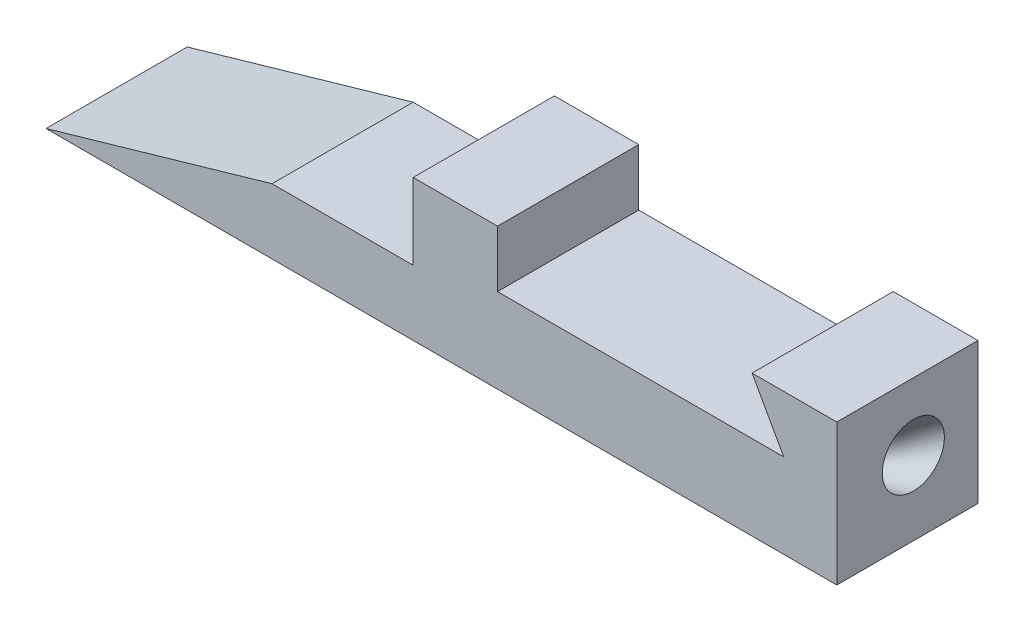
ISO-10303-21;
HEADER;
FILE_DESCRIPTION(('STEP AP214'),'2;1');
FILE_NAME('part.step','',(''),(''),'','','');
FILE_SCHEMA(('AUTOMOTIVE_DESIGN { 1 0 10303 214 1 1 1 1 }'));
ENDSEC;
DATA;
#1=APPLICATION_CONTEXT('core data for automotive mechanical design processes');
#2=APPLICATION_PROTOCOL_DEFINITION('international standard','automotive_design',2000,#1);
#3=PRODUCT_CONTEXT('',#1,'mechanical');
#4=PRODUCT('Part','Part','',(#3));
#5=PRODUCT_RELATED_PRODUCT_CATEGORY('part','',(#4));
#6=PRODUCT_DEFINITION_FORMATION('','',#4);
#7=PRODUCT_DEFINITION_CONTEXT('part definition',#1,'design');
#8=PRODUCT_DEFINITION('design','',#6,#7);
#9=PRODUCT_DEFINITION_SHAPE('','',#8);
#10=(LENGTH_UNIT() NAMED_UNIT(*) SI_UNIT(.MILLI.,.METRE.));
#11=(NAMED_UNIT(*) PLANE_ANGLE_UNIT() SI_UNIT($,.RADIAN.));
#12=(NAMED_UNIT(*) SI_UNIT($,.STERADIAN.) SOLID_ANGLE_UNIT());
#13=UNCERTAINTY_MEASURE_WITH_UNIT(LENGTH_MEASURE(1.E-05),#10,'distance_accuracy_value','');
#14=(GEOMETRIC_REPRESENTATION_CONTEXT(3) GLOBAL_UNCERTAINTY_ASSIGNED_CONTEXT((#13)) GLOBAL_UNIT_ASSIGNED_CONTEXT((#10,
#11,#12)) REPRESENTATION_CONTEXT('',''));
#15=CARTESIAN_POINT('',(0.,0.,0.));
#16=DIRECTION('',(0.,0.,1.));
#17=DIRECTION('',(1.,0.,0.));
#18=AXIS2_PLACEMENT_3D('',#15,#16,#17);
#19=CARTESIAN_POINT('',(0.,5.,0.));
#20=DIRECTION('',(0.,0.,-1.));
#21=DIRECTION('',(-1.,0.,0.));
#22=AXIS2_PLACEMENT_3D('',#19,#20,#21);
#23=PLANE('',#22);
#24=DIRECTION('',(0.487128200879869,-0.873330473479279,0.));
#25=VECTOR('',#24,1.);
#26=CARTESIAN_POINT('',(12.,5.,0.));
#27=LINE('',#26,#25);
#28=CARTESIAN_POINT('',(12.,5.,0.));
#29=VERTEX_POINT('',#28);
#30=CARTESIAN_POINT('',(13.1203948620237,2.99133991099766,0.));
#31=VERTEX_POINT('',#30);
#32=EDGE_CURVE('E193',#29,#31,#27,.T.);
#33=ORIENTED_EDGE('',*,*,#32,.T.);
#34=DIRECTION('',(1.,0.,0.));
#35=VECTOR('',#34,1.);
#36=CARTESIAN_POINT('',(2.98623493666464,2.99133991099766,0.));
#37=LINE('',#36,#35);
#38=CARTESIAN_POINT('',(2.98623493666464,2.99133991099766,0.));
#39=VERTEX_POINT('',#38);
#40=EDGE_CURVE('E188',#39,#31,#37,.T.);
#41=ORIENTED_EDGE('',*,*,#40,.F.);
#42=DIRECTION('',(0.,-1.,0.));
#43=VECTOR('',#42,1.);
#44=CARTESIAN_POINT('',(2.98623493666464,5.,0.));
#45=LINE('',#44,#43);
#46=CARTESIAN_POINT('',(2.98623493666464,5.,0.));
#47=VERTEX_POINT('',#46);
#48=EDGE_CURVE('E184',#47,#39,#45,.T.);
#49=ORIENTED_EDGE('',*,*,#48,.F.);
#50=DIRECTION('',(1.,0.,0.));
#51=VECTOR('',#50,1.);
#52=CARTESIAN_POINT('',(0.,5.,0.));
#53=LINE('',#52,#51);
#54=CARTESIAN_POINT('',(0.,5.,0.));
#55=VERTEX_POINT('',#54);
#56=EDGE_CURVE('E230',#55,#47,#53,.T.);
#57=ORIENTED_EDGE('',*,*,#56,.F.);
#58=DIRECTION('',(0.,-1.,0.));
#59=VECTOR('',#58,1.);
#60=CARTESIAN_POINT('',(0.,5.,0.));
#61=LINE('',#60,#59);
#62=CARTESIAN_POINT('',(0.,2.30658029150277,0.));
#63=VERTEX_POINT('',#62);
#64=EDGE_CURVE('E12',#55,#63,#61,.T.);
#65=ORIENTED_EDGE('',*,*,#64,.T.);
#66=DIRECTION('',(1.,0.,0.));
#67=VECTOR('',#66,1.);
#68=CARTESIAN_POINT('',(-5.,2.30658029150277,0.));
#69=LINE('',#68,#67);
#70=CARTESIAN_POINT('',(-5.,2.30658029150277,0.));
#71=VERTEX_POINT('',#70);
#72=EDGE_CURVE('E179',#71,#63,#69,.T.);
#73=ORIENTED_EDGE('',*,*,#72,.F.);
#74=DIRECTION('',(-0.960876363236828,-0.276977642730901,0.));
#75=VECTOR('',#74,1.);
#76=CARTESIAN_POINT('',(-13.0018678047824,0.,0.));
#77=LINE('',#76,#75);
#78=CARTESIAN_POINT('',(-13.0018678047824,0.,0.));
#79=VERTEX_POINT('',#78);
#80=EDGE_CURVE('E165',#71,#79,#77,.T.);
#81=ORIENTED_EDGE('',*,*,#80,.T.);
#82=DIRECTION('',(1.,0.,0.));
#83=VECTOR('',#82,1.);
#84=CARTESIAN_POINT('',(0.,0.,0.));
#85=LINE('',#84,#83);
#86=CARTESIAN_POINT('',(15.,0.,0.));
#87=VERTEX_POINT('',#86);
#88=EDGE_CURVE('E156',#79,#87,#85,.T.);
#89=ORIENTED_EDGE('',*,*,#88,.T.);
#90=DIRECTION('',(0.,-1.,0.));
#91=VECTOR('',#90,1.);
#92=CARTESIAN_POINT('',(15.,5.,0.));
#93=LINE('',#92,#91);
#94=CARTESIAN_POINT('',(15.,5.,0.));
#95=VERTEX_POINT('',#94);
#96=EDGE_CURVE('E67',#95,#87,#93,.T.);
#97=ORIENTED_EDGE('',*,*,#96,.F.);
#98=EDGE_CURVE('E229',#29,#95,#53,.T.);
#99=ORIENTED_EDGE('',*,*,#98,.F.);
#100=EDGE_LOOP('',(#33,#41,#49,#57,#65,#73,#81,#89,#97,#99));
#101=FACE_BOUND('',#100,.T.);
#102=ADVANCED_FACE('F55',(#101),#23,.F.);
#103=CARTESIAN_POINT('',(0.,5.,-5.));
#104=DIRECTION('',(0.,0.,-1.));
#105=DIRECTION('',(-1.,0.,0.));
#106=AXIS2_PLACEMENT_3D('',#103,#104,#105);
#107=PLANE('',#106);
#108=DIRECTION('',(1.,0.,0.));
#109=VECTOR('',#108,1.);
#110=CARTESIAN_POINT('',(2.98623493666464,2.99133991099766,-5.));
#111=LINE('',#110,#109);
#112=CARTESIAN_POINT('',(2.98623493666464,2.99133991099766,-5.));
#113=VERTEX_POINT('',#112);
#114=CARTESIAN_POINT('',(13.1203948620237,2.99133991099766,-5.));
#115=VERTEX_POINT('',#114);
#116=EDGE_CURVE('E197',#113,#115,#111,.T.);
#117=ORIENTED_EDGE('',*,*,#116,.T.);
#118=DIRECTION('',(0.487128200879869,-0.873330473479279,0.));
#119=VECTOR('',#118,1.);
#120=CARTESIAN_POINT('',(12.,5.,-5.));
#121=LINE('',#120,#119);
#122=CARTESIAN_POINT('',(12.,5.,-5.));
#123=VERTEX_POINT('',#122);
#124=EDGE_CURVE('E151',#123,#115,#121,.T.);
#125=ORIENTED_EDGE('',*,*,#124,.F.);
#126=DIRECTION('',(1.,0.,0.));
#127=VECTOR('',#126,1.);
#128=CARTESIAN_POINT('',(0.,5.,-5.));
#129=LINE('',#128,#127);
#130=CARTESIAN_POINT('',(15.,5.,-5.));
#131=VERTEX_POINT('',#130);
#132=EDGE_CURVE('E220',#123,#131,#129,.T.);
#133=ORIENTED_EDGE('',*,*,#132,.T.);
#134=DIRECTION('',(0.,-1.,0.));
#135=VECTOR('',#134,1.);
#136=CARTESIAN_POINT('',(15.,5.,-5.));
#137=LINE('',#136,#135);
#138=CARTESIAN_POINT('',(15.,0.,-5.));
#139=VERTEX_POINT('',#138);
#140=EDGE_CURVE('E145',#131,#139,#137,.T.);
#141=ORIENTED_EDGE('',*,*,#140,.T.);
#142=DIRECTION('',(1.,0.,0.));
#143=VECTOR('',#142,1.);
#144=CARTESIAN_POINT('',(0.,0.,-5.));
#145=LINE('',#144,#143);
#146=CARTESIAN_POINT('',(-13.0018678047824,0.,-5.));
#147=VERTEX_POINT('',#146);
#148=EDGE_CURVE('E136',#147,#139,#145,.T.);
#149=ORIENTED_EDGE('',*,*,#148,.F.);
#150=DIRECTION('',(-0.960876363236828,-0.276977642730901,0.));
#151=VECTOR('',#150,1.);
#152=CARTESIAN_POINT('',(-13.0018678047824,0.,-5.));
#153=LINE('',#152,#151);
#154=CARTESIAN_POINT('',(-5.,2.30658029150277,-5.));
#155=VERTEX_POINT('',#154);
#156=EDGE_CURVE('E142',#155,#147,#153,.T.);
#157=ORIENTED_EDGE('',*,*,#156,.F.);
#158=DIRECTION('',(1.,0.,0.));
#159=VECTOR('',#158,1.);
#160=CARTESIAN_POINT('',(-5.,2.30658029150277,-5.));
#161=LINE('',#160,#159);
#162=CARTESIAN_POINT('',(0.,2.30658029150277,-5.));
#163=VERTEX_POINT('',#162);
#164=EDGE_CURVE('E174',#155,#163,#161,.T.);
#165=ORIENTED_EDGE('',*,*,#164,.T.);
#166=DIRECTION('',(0.,-1.,0.));
#167=VECTOR('',#166,1.);
#168=CARTESIAN_POINT('',(0.,5.,-5.));
#169=LINE('',#168,#167);
#170=CARTESIAN_POINT('',(0.,5.,-5.));
#171=VERTEX_POINT('',#170);
#172=EDGE_CURVE('E233',#171,#163,#169,.T.);
#173=ORIENTED_EDGE('',*,*,#172,.F.);
#174=CARTESIAN_POINT('',(2.98623493666464,5.,-5.));
#175=VERTEX_POINT('',#174);
#176=EDGE_CURVE('E221',#171,#175,#129,.T.);
#177=ORIENTED_EDGE('',*,*,#176,.T.);
#178=DIRECTION('',(0.,-1.,0.));
#179=VECTOR('',#178,1.);
#180=CARTESIAN_POINT('',(2.98623493666464,5.,-5.));
#181=LINE('',#180,#179);
#182=EDGE_CURVE('E82',#175,#113,#181,.T.);
#183=ORIENTED_EDGE('',*,*,#182,.T.);
#184=EDGE_LOOP('',(#117,#125,#133,#141,#149,#157,#165,#173,#177,#183));
#185=FACE_BOUND('',#184,.T.);
#186=ADVANCED_FACE('F139',(#185),#107,.T.);
#187=CARTESIAN_POINT('',(0.,5.,0.));
#188=DIRECTION('',(0.,-1.,0.));
#189=DIRECTION('',(0.,0.,-1.));
#190=AXIS2_PLACEMENT_3D('',#187,#188,#189);
#191=PLANE('',#190);
#192=DIRECTION('',(0.,0.,1.));
#193=VECTOR('',#192,1.);
#194=CARTESIAN_POINT('',(12.,5.,-15.3313074073858));
#195=LINE('',#194,#193);
#196=EDGE_CURVE('E183',#123,#29,#195,.T.);
#197=ORIENTED_EDGE('',*,*,#196,.T.);
#198=ORIENTED_EDGE('',*,*,#98,.T.);
#199=DIRECTION('',(0.,0.,-1.));
#200=VECTOR('',#199,1.);
#201=CARTESIAN_POINT('',(15.,5.,0.));
#202=LINE('',#201,#200);
#203=EDGE_CURVE('E225',#95,#131,#202,.T.);
#204=ORIENTED_EDGE('',*,*,#203,.T.);
#205=ORIENTED_EDGE('',*,*,#132,.F.);
#206=EDGE_LOOP('',(#197,#198,#204,#205));
#207=FACE_BOUND('',#206,.T.);
#208=ADVANCED_FACE('F274',(#207),#191,.F.);
#209=CARTESIAN_POINT('',(0.,5.,0.));
#210=DIRECTION('',(-1.,0.,0.));
#211=DIRECTION('',(0.,0.,1.));
#212=AXIS2_PLACEMENT_3D('',#209,#210,#211);
#213=PLANE('',#212);
#214=DIRECTION('',(0.,0.,-1.));
#215=VECTOR('',#214,1.);
#216=CARTESIAN_POINT('',(0.,2.30658029150277,0.));
#217=LINE('',#216,#215);
#218=EDGE_CURVE('E75',#63,#163,#217,.T.);
#219=ORIENTED_EDGE('',*,*,#218,.F.);
#220=ORIENTED_EDGE('',*,*,#64,.F.);
#221=DIRECTION('',(0.,0.,-1.));
#222=VECTOR('',#221,1.);
#223=CARTESIAN_POINT('',(0.,5.,0.));
#224=LINE('',#223,#222);
#225=EDGE_CURVE('E216',#55,#171,#224,.T.);
#226=ORIENTED_EDGE('',*,*,#225,.T.);
#227=ORIENTED_EDGE('',*,*,#172,.T.);
#228=EDGE_LOOP('',(#219,#220,#226,#227));
#229=FACE_BOUND('',#228,.T.);
#230=ADVANCED_FACE('F57',(#229),#213,.T.);
#231=CARTESIAN_POINT('',(15.,5.,0.));
#232=DIRECTION('',(-1.,0.,0.));
#233=DIRECTION('',(0.,0.,1.));
#234=AXIS2_PLACEMENT_3D('',#231,#232,#233);
#235=PLANE('',#234);
#236=CARTESIAN_POINT('',(15.,2.62562663396286,-2.7093762675392));
#237=DIRECTION('',(1.,0.,0.));
#238=DIRECTION('',(0.,0.,-1.));
#239=AXIS2_PLACEMENT_3D('',#236,#237,#238);
#240=CIRCLE('',#239,1.09960657927983);
#241=CARTESIAN_POINT('',(15.,1.57162976837628,-3.02278532377267));
#242=VERTEX_POINT('',#241);
#243=EDGE_CURVE('E168',#242,#242,#240,.T.);
#244=ORIENTED_EDGE('',*,*,#243,.F.);
#245=EDGE_LOOP('',(#244));
#246=FACE_BOUND('',#245,.T.);
#247=DIRECTION('',(0.,0.,-1.));
#248=VECTOR('',#247,1.);
#249=CARTESIAN_POINT('',(15.,0.,0.));
#250=LINE('',#249,#248);
#251=EDGE_CURVE('E150',#87,#139,#250,.T.);
#252=ORIENTED_EDGE('',*,*,#251,.T.);
#253=ORIENTED_EDGE('',*,*,#140,.F.);
#254=ORIENTED_EDGE('',*,*,#203,.F.);
#255=ORIENTED_EDGE('',*,*,#96,.T.);
#256=EDGE_LOOP('',(#252,#253,#254,#255));
#257=FACE_BOUND('',#256,.T.);
#258=ADVANCED_FACE('F269',(#246,#257),#235,.F.);
#259=ORIENTED_EDGE('',*,*,#56,.T.);
#260=DIRECTION('',(0.,0.,1.));
#261=VECTOR('',#260,1.);
#262=CARTESIAN_POINT('',(2.98623493666464,5.,-15.3313074073858));
#263=LINE('',#262,#261);
#264=EDGE_CURVE('E189',#175,#47,#263,.T.);
#265=ORIENTED_EDGE('',*,*,#264,.F.);
#266=ORIENTED_EDGE('',*,*,#176,.F.);
#267=ORIENTED_EDGE('',*,*,#225,.F.);
#268=EDGE_LOOP('',(#259,#265,#266,#267));
#269=FACE_BOUND('',#268,.T.);
#270=ADVANCED_FACE('F265',(#269),#191,.F.);
#271=CARTESIAN_POINT('',(0.,0.,0.));
#272=DIRECTION('',(0.,-1.,0.));
#273=DIRECTION('',(0.,0.,-1.));
#274=AXIS2_PLACEMENT_3D('',#271,#272,#273);
#275=PLANE('',#274);
#276=CARTESIAN_POINT('',(10.7758575453581,0.,-2.63389046128069));
#277=DIRECTION('',(0.,-1.,0.));
#278=DIRECTION('',(0.,0.,-1.));
#279=AXIS2_PLACEMENT_3D('',#276,#277,#278);
#280=CIRCLE('',#279,1.09960657927984);
#281=CARTESIAN_POINT('',(10.7758575453581,0.,-3.73349704056053));
#282=VERTEX_POINT('',#281);
#283=EDGE_CURVE('E250',#282,#282,#280,.T.);
#284=ORIENTED_EDGE('',*,*,#283,.F.);
#285=EDGE_LOOP('',(#284));
#286=FACE_BOUND('',#285,.T.);
#287=ORIENTED_EDGE('',*,*,#88,.F.);
#288=DIRECTION('',(0.,0.,1.));
#289=VECTOR('',#288,1.);
#290=CARTESIAN_POINT('',(-13.0018678047824,0.,-13.3276768072712));
#291=LINE('',#290,#289);
#292=EDGE_CURVE('E154',#147,#79,#291,.T.);
#293=ORIENTED_EDGE('',*,*,#292,.F.);
#294=ORIENTED_EDGE('',*,*,#148,.T.);
#295=ORIENTED_EDGE('',*,*,#251,.F.);
#296=EDGE_LOOP('',(#287,#293,#294,#295));
#297=FACE_BOUND('',#296,.T.);
#298=ADVANCED_FACE('F155',(#286,#297),#275,.T.);
#299=CARTESIAN_POINT('',(12.,5.,-15.3313074073858));
#300=DIRECTION('',(-0.873330473479279,-0.487128200879869,0.));
#301=DIRECTION('',(0.487128200879869,-0.873330473479279,0.));
#302=AXIS2_PLACEMENT_3D('',#299,#300,#301);
#303=PLANE('',#302);
#304=ORIENTED_EDGE('',*,*,#124,.T.);
#305=DIRECTION('',(0.,0.,1.));
#306=VECTOR('',#305,1.);
#307=CARTESIAN_POINT('',(13.1203948620237,2.99133991099766,-15.3313074073858));
#308=LINE('',#307,#306);
#309=EDGE_CURVE('E201',#115,#31,#308,.T.);
#310=ORIENTED_EDGE('',*,*,#309,.T.);
#311=ORIENTED_EDGE('',*,*,#32,.F.);
#312=ORIENTED_EDGE('',*,*,#196,.F.);
#313=EDGE_LOOP('',(#304,#310,#311,#312));
#314=FACE_BOUND('',#313,.T.);
#315=ADVANCED_FACE('F264',(#314),#303,.T.);
#316=CARTESIAN_POINT('',(2.98623493666464,2.99133991099766,-15.3313074073858));
#317=DIRECTION('',(0.,-1.,0.));
#318=DIRECTION('',(0.,0.,-1.));
#319=AXIS2_PLACEMENT_3D('',#316,#317,#318);
#320=PLANE('',#319);
#321=DIRECTION('',(0.,0.,1.));
#322=VECTOR('',#321,1.);
#323=CARTESIAN_POINT('',(2.98623493666464,2.99133991099766,-15.3313074073858));
#324=LINE('',#323,#322);
#325=EDGE_CURVE('E200',#113,#39,#324,.T.);
#326=ORIENTED_EDGE('',*,*,#325,.T.);
#327=ORIENTED_EDGE('',*,*,#40,.T.);
#328=ORIENTED_EDGE('',*,*,#309,.F.);
#329=ORIENTED_EDGE('',*,*,#116,.F.);
#330=EDGE_LOOP('',(#326,#327,#328,#329));
#331=FACE_BOUND('',#330,.T.);
#332=ADVANCED_FACE('F295',(#331),#320,.F.);
#333=CARTESIAN_POINT('',(2.98623493666464,5.,-15.3313074073858));
#334=DIRECTION('',(-1.,0.,0.));
#335=DIRECTION('',(0.,0.,1.));
#336=AXIS2_PLACEMENT_3D('',#333,#334,#335);
#337=PLANE('',#336);
#338=ORIENTED_EDGE('',*,*,#264,.T.);
#339=ORIENTED_EDGE('',*,*,#48,.T.);
#340=ORIENTED_EDGE('',*,*,#325,.F.);
#341=ORIENTED_EDGE('',*,*,#182,.F.);
#342=EDGE_LOOP('',(#338,#339,#340,#341));
#343=FACE_BOUND('',#342,.T.);
#344=ADVANCED_FACE('F292',(#343),#337,.F.);
#345=CARTESIAN_POINT('',(-5.,2.30658029150277,0.));
#346=DIRECTION('',(0.,-1.,0.));
#347=DIRECTION('',(0.,0.,-1.));
#348=AXIS2_PLACEMENT_3D('',#345,#346,#347);
#349=PLANE('',#348);
#350=ORIENTED_EDGE('',*,*,#218,.T.);
#351=ORIENTED_EDGE('',*,*,#164,.F.);
#352=DIRECTION('',(0.,0.,-1.));
#353=VECTOR('',#352,1.);
#354=CARTESIAN_POINT('',(-5.,2.30658029150277,0.));
#355=LINE('',#354,#353);
#356=EDGE_CURVE('E163',#71,#155,#355,.T.);
#357=ORIENTED_EDGE('',*,*,#356,.F.);
#358=ORIENTED_EDGE('',*,*,#72,.T.);
#359=EDGE_LOOP('',(#350,#351,#357,#358));
#360=FACE_BOUND('',#359,.T.);
#361=ADVANCED_FACE('F298',(#360),#349,.F.);
#362=CARTESIAN_POINT('',(-13.0018678047824,0.,-13.3276768072712));
#363=DIRECTION('',(-0.276977642730901,0.960876363236828,0.));
#364=DIRECTION('',(-0.960876363236828,-0.276977642730901,0.));
#365=AXIS2_PLACEMENT_3D('',#362,#363,#364);
#366=PLANE('',#365);
#367=ORIENTED_EDGE('',*,*,#356,.T.);
#368=ORIENTED_EDGE('',*,*,#156,.T.);
#369=ORIENTED_EDGE('',*,*,#292,.T.);
#370=ORIENTED_EDGE('',*,*,#80,.F.);
#371=EDGE_LOOP('',(#367,#368,#369,#370));
#372=FACE_BOUND('',#371,.T.);
#373=ADVANCED_FACE('F162',(#372),#366,.T.);
#374=CARTESIAN_POINT('',(10.7758575453581,0.,-3.73349704056053));
#375=CARTESIAN_POINT('',(15.,1.57162976837628,-3.02278532377267));
#376=CARTESIAN_POINT('',(10.6842236637514,0.,-3.73349704056052));
#377=CARTESIAN_POINT('',(15.,1.59774718972907,-3.11061839590489));
#378=CARTESIAN_POINT('',(10.580567416878,0.,-3.72235436055716));
#379=CARTESIAN_POINT('',(15.,1.63797171833462,-3.20679928866435));
#380=CARTESIAN_POINT('',(10.3553679894415,0.,-3.65667119422151));
#381=CARTESIAN_POINT('',(15.,1.76511663915561,-3.4039368791108));
#382=CARTESIAN_POINT('',(10.2333849662467,0.,-3.60154425104695));
#383=CARTESIAN_POINT('',(15.,1.85272452665518,-3.50514802404737));
#384=CARTESIAN_POINT('',(9.99880222933366,0.,-3.42560719836217));
#385=CARTESIAN_POINT('',(15.,2.08822462381217,-3.67985523970848));
#386=CARTESIAN_POINT('',(9.88678694319526,0.,-3.30354706319505));
#387=CARTESIAN_POINT('',(15.,2.23714843718079,-3.75243484247284));
#388=CARTESIAN_POINT('',(9.72444594879178,0.,-2.99915769868852));
#389=CARTESIAN_POINT('',(15.,2.57518258589898,-3.82128539068397));
#390=CARTESIAN_POINT('',(9.67625096607825,0.,-2.817158224494));
#391=CARTESIAN_POINT('',(15.,2.7633695459319,-3.81560797583136));
#392=CARTESIAN_POINT('',(9.67625096607825,0.,-2.45062269806738));
#393=CARTESIAN_POINT('',(15.,3.11470183446077,-3.7111382904202));
#394=CARTESIAN_POINT('',(9.72444594879178,0.,-2.26862322387285));
#395=CARTESIAN_POINT('',(15.,3.27541579763816,-3.61306899346312));
#396=CARTESIAN_POINT('',(9.88678694319526,0.,-1.96423385936633));
#397=CARTESIAN_POINT('',(15.,3.5209093253693,-3.37070478090128));
#398=CARTESIAN_POINT('',(9.99880222933367,0.,-1.84217372419921));
#399=CARTESIAN_POINT('',(15.,3.60598011025685,-3.22854619873228));
#400=CARTESIAN_POINT('',(10.2333849662467,0.,-1.66623667151443));
#401=CARTESIAN_POINT('',(15.,3.70775901008757,-2.95354808507646));
#402=CARTESIAN_POINT('',(10.3553679894415,0.,-1.61110972833987));
#403=CARTESIAN_POINT('',(15.,3.72583187497748,-2.82091245876821));
#404=CARTESIAN_POINT('',(10.580567416878,0.,-1.54542656200422));
#405=CARTESIAN_POINT('',(15.,3.72460444636523,-2.5863329330704));
#406=CARTESIAN_POINT('',(10.6842236637514,0.,-1.53428388200085));
#407=CARTESIAN_POINT('',(15.,3.70574092090223,-2.48380028343794));
#408=CARTESIAN_POINT('',(10.8674914269647,0.,-1.53428388200085));
#409=CARTESIAN_POINT('',(15.,3.65350607819666,-2.30813413917351));
#410=CARTESIAN_POINT('',(10.9711476738382,0.,-1.54542656200422));
#411=CARTESIAN_POINT('',(15.,3.6132815495911,-2.21195324641405));
#412=CARTESIAN_POINT('',(11.1963471012747,0.,-1.61110972833987));
#413=CARTESIAN_POINT('',(15.,3.48613662877012,-2.01481565596759));
#414=CARTESIAN_POINT('',(11.3183301244695,0.,-1.66623667151443));
#415=CARTESIAN_POINT('',(15.,3.39852874127054,-1.91360451103103));
#416=CARTESIAN_POINT('',(11.5529128613825,0.,-1.84217372419921));
#417=CARTESIAN_POINT('',(15.,3.16302864411355,-1.73889729536991));
#418=CARTESIAN_POINT('',(11.6649281475209,0.,-1.96423385936633));
#419=CARTESIAN_POINT('',(15.,3.01410483074493,-1.66631769260556));
#420=CARTESIAN_POINT('',(11.8272691419244,0.,-2.26862322387285));
#421=CARTESIAN_POINT('',(15.,2.67607068202674,-1.59746714439443));
#422=CARTESIAN_POINT('',(11.8754641246379,0.,-2.45062269806738));
#423=CARTESIAN_POINT('',(15.,2.48788372199382,-1.60314455924704));
#424=CARTESIAN_POINT('',(11.8754641246379,0.,-2.817158224494));
#425=CARTESIAN_POINT('',(15.,2.13655143346496,-1.70761424465819));
#426=CARTESIAN_POINT('',(11.8272691419244,0.,-2.99915769868852));
#427=CARTESIAN_POINT('',(15.,1.97583747028756,-1.80568354161528));
#428=CARTESIAN_POINT('',(11.6649281475209,0.,-3.30354706319505));
#429=CARTESIAN_POINT('',(15.,1.73034394255643,-2.04804775417712));
#430=CARTESIAN_POINT('',(11.5529128613825,0.,-3.42560719836217));
#431=CARTESIAN_POINT('',(15.,1.64527315766887,-2.19020633634611));
#432=CARTESIAN_POINT('',(11.3183301244695,0.,-3.60154425104695));
#433=CARTESIAN_POINT('',(15.,1.54349425783816,-2.46520445000194));
#434=CARTESIAN_POINT('',(11.1963471012747,0.,-3.65667119422151));
#435=CARTESIAN_POINT('',(15.,1.52542139294825,-2.59784007631018));
#436=CARTESIAN_POINT('',(10.9711476738382,0.,-3.72235436055716));
#437=CARTESIAN_POINT('',(15.,1.52664882156049,-2.832419602008));
#438=CARTESIAN_POINT('',(10.8674914269647,0.,-3.73349704056053));
#439=CARTESIAN_POINT('',(15.,1.54551234702349,-2.93495225164046));
#440=CARTESIAN_POINT('',(10.7758575453581,0.,-3.73349704056053));
#441=CARTESIAN_POINT('',(15.,1.57162976837628,-3.02278532377267));
#442=B_SPLINE_SURFACE_WITH_KNOTS('',3,1,((#374,#375),(#376,#377),(#378,#379),(#380,#381),(#382,
#383),(#384,#385),(#386,#387),(#388,#389),(#390,#391),(#392,#393),(#394,#395),(#396,#397),(#398,
#399),(#400,#401),(#402,#403),(#404,#405),(#406,#407),(#408,#409),(#410,#411),(#412,#413),(#414,
#415),(#416,#417),(#418,#419),(#420,#421),(#422,#423),(#424,#425),(#426,#427),(#428,#429),(#430,
#431),(#432,#433),(#434,#435),(#436,#437),(#438,#439),(#440,#441)),.UNSPECIFIED.,.T.,.F.,.F.,(4,
2,2,2,2,2,2,2,2,2,2,2,2,2,2,2,4),(2,2),(0.,0.0625,0.125,0.1875,0.25,0.3125,0.375,0.4375,0.5,
0.5625,0.625,0.6875,0.75,0.8125,0.875,0.9375,1.),(0.,1.),.UNSPECIFIED.);
#443=CARTESIAN_POINT('',(10.7758575453581,0.,-3.73349704056053));
#444=CARTESIAN_POINT('',(10.8198590292606,0.0163711434205856,-3.72609379351065));
#445=CARTESIAN_POINT('',(10.8638605131631,0.032742286841172,-3.71869054646078));
#446=CARTESIAN_POINT('',(10.9518634809682,0.0654845736823449,-3.70388405236103));
#447=CARTESIAN_POINT('',(10.9958649648707,0.0818557171029314,-3.69648080531116));
#448=CARTESIAN_POINT('',(11.0838679326757,0.114598003944104,-3.68167431121141));
#449=CARTESIAN_POINT('',(11.1278694165782,0.13096914736469,-3.67427106416154));
#450=CARTESIAN_POINT('',(11.2158723843833,0.163711434205862,-3.65946457006179));
#451=CARTESIAN_POINT('',(11.2598738682858,0.180082577626449,-3.65206132301192));
#452=CARTESIAN_POINT('',(11.3478768360908,0.212824864467621,-3.63725482891217));
#453=CARTESIAN_POINT('',(11.3918783199934,0.229196007888207,-3.6298515818623));
#454=CARTESIAN_POINT('',(11.4798812877984,0.26193829472938,-3.61504508776255));
#455=CARTESIAN_POINT('',(11.5238827717009,0.278309438149966,-3.60764184071268));
#456=CARTESIAN_POINT('',(11.611885739506,0.311051724991138,-3.59283534661293));
#457=CARTESIAN_POINT('',(11.6558872234085,0.327422868411724,-3.58543209956306));
#458=CARTESIAN_POINT('',(11.7438901912135,0.360165155252897,-3.57062560546331));
#459=CARTESIAN_POINT('',(11.787891675116,0.376536298673483,-3.56322235841344));
#460=CARTESIAN_POINT('',(11.8758946429211,0.409278585514656,-3.54841586431369));
#461=CARTESIAN_POINT('',(11.9198961268236,0.425649728935242,-3.54101261726381));
#462=CARTESIAN_POINT('',(12.0078990946286,0.458392015776414,-3.52620612316407));
#463=CARTESIAN_POINT('',(12.0519005785312,0.474763159197001,-3.51880287611419));
#464=CARTESIAN_POINT('',(12.1399035463362,0.507505446038173,-3.50399638201445));
#465=CARTESIAN_POINT('',(12.1839050302387,0.523876589458759,-3.49659313496457));
#466=CARTESIAN_POINT('',(12.2719079980438,0.556618876299932,-3.48178664086483));
#467=CARTESIAN_POINT('',(12.3159094819463,0.572990019720518,-3.47438339381495));
#468=CARTESIAN_POINT('',(12.4039124497513,0.605732306561691,-3.45957689971521));
#469=CARTESIAN_POINT('',(12.4479139336538,0.622103449982276,-3.45217365266533));
#470=CARTESIAN_POINT('',(12.5359169014589,0.654845736823449,-3.43736715856559));
#471=CARTESIAN_POINT('',(12.5799183853614,0.671216880244035,-3.42996391151571));
#472=CARTESIAN_POINT('',(12.6679213531664,0.703959167085208,-3.41515741741597));
#473=CARTESIAN_POINT('',(12.711922837069,0.720330310505794,-3.40775417036609));
#474=CARTESIAN_POINT('',(12.799925804874,0.753072597346966,-3.39294767626635));
#475=CARTESIAN_POINT('',(12.8439272887765,0.769443740767553,-3.38554442921647));
#476=CARTESIAN_POINT('',(12.9319302565816,0.802186027608725,-3.37073793511672));
#477=CARTESIAN_POINT('',(12.9759317404841,0.818557171029311,-3.36333468806685));
#478=CARTESIAN_POINT('',(13.0639347082891,0.851299457870484,-3.3485281939671));
#479=CARTESIAN_POINT('',(13.1079361921916,0.86767060129107,-3.34112494691723));
#480=CARTESIAN_POINT('',(13.1959391599967,0.900412888132242,-3.32631845281748));
#481=CARTESIAN_POINT('',(13.2399406438992,0.916784031552829,-3.31891520576761));
#482=CARTESIAN_POINT('',(13.3279436117042,0.949526318394001,-3.30410871166786));
#483=CARTESIAN_POINT('',(13.3719450956068,0.965897461814587,-3.29670546461799));
#484=CARTESIAN_POINT('',(13.4599480634118,0.99863974865576,-3.28189897051824));
#485=CARTESIAN_POINT('',(13.5039495473143,1.01501089207635,-3.27449572346837));
#486=CARTESIAN_POINT('',(13.5919525151194,1.04775317891752,-3.25968922936862));
#487=CARTESIAN_POINT('',(13.6359539990219,1.0641243223381,-3.25228598231875));
#488=CARTESIAN_POINT('',(13.7239569668269,1.09686660917928,-3.237479488219));
#489=CARTESIAN_POINT('',(13.7679584507294,1.11323775259986,-3.23007624116913));
#490=CARTESIAN_POINT('',(13.8559614185345,1.14598003944104,-3.21526974706938));
#491=CARTESIAN_POINT('',(13.899962902437,1.16235118286162,-3.20786650001951));
#492=CARTESIAN_POINT('',(13.987965870242,1.19509346970279,-3.19306000591976));
#493=CARTESIAN_POINT('',(14.0319673541446,1.21146461312338,-3.18565675886989));
#494=CARTESIAN_POINT('',(14.1199703219496,1.24420689996455,-3.17085026477014));
#495=CARTESIAN_POINT('',(14.1639718058521,1.26057804338514,-3.16344701772027));
#496=CARTESIAN_POINT('',(14.2519747736572,1.29332033022631,-3.14864052362052));
#497=CARTESIAN_POINT('',(14.2959762575597,1.3096914736469,-3.14123727657065));
#498=CARTESIAN_POINT('',(14.3839792253647,1.34243376048807,-3.1264307824709));
#499=CARTESIAN_POINT('',(14.4279807092672,1.35880490390866,-3.11902753542103));
#500=CARTESIAN_POINT('',(14.5159836770723,1.39154719074983,-3.10422104132128));
#501=CARTESIAN_POINT('',(14.5599851609748,1.40791833417042,-3.09681779427141));
#502=CARTESIAN_POINT('',(14.6479881287798,1.44066062101159,-3.08201130017166));
#503=CARTESIAN_POINT('',(14.6919896126824,1.45703176443217,-3.07460805312179));
#504=CARTESIAN_POINT('',(14.7799925804874,1.48977405127335,-3.05980155902204));
#505=CARTESIAN_POINT('',(14.8239940643899,1.50614519469393,-3.05239831197216));
#506=CARTESIAN_POINT('',(14.911997032195,1.53888748153511,-3.03759181787242));
#507=CARTESIAN_POINT('',(14.9559985160975,1.55525862495569,-3.03018857082254));
#508=CARTESIAN_POINT('',(15.,1.57162976837628,-3.02278532377267));
#509=B_SPLINE_CURVE_WITH_KNOTS('',3,(#443,#444,#445,#446,#447,#448,#449,#450,#451,#452,#453,
#454,#455,#456,#457,#458,#459,#460,#461,#462,#463,#464,#465,#466,#467,#468,#469,#470,#471,#472,
#473,#474,#475,#476,#477,#478,#479,#480,#481,#482,#483,#484,#485,#486,#487,#488,#489,#490,#491,
#492,#493,#494,#495,#496,#497,#498,#499,#500,#501,#502,#503,#504,#505,#506,#507,#508),
.UNSPECIFIED.,.F.,.F.,(4,2,2,2,2,2,2,2,2,2,2,2,2,2,2,2,2,2,2,2,2,2,2,2,2,2,2,2,2,2,2,2,4),(0.,
0.142585332010778,0.285170664021553,0.427755996032331,0.570341328043106,0.712926660053882,
0.855511992064658,0.998097324075436,1.14068265608621,1.28326798809699,1.42585332010776,
1.56843865211854,1.71102398412932,1.8536093161401,1.99619464815087,2.13877998016165,
2.28136531217242,2.4239506441832,2.56653597619398,2.70912130820475,2.85170664021553,
2.9942919722263,3.13687730423708,3.27946263624786,3.42204796825863,3.56463330026941,
3.70721863228019,3.84980396429096,3.99238929630174,4.13497462831251,4.27755996032329,
4.42014529233407,4.56273062434484),.UNSPECIFIED.);
#510=EDGE_CURVE('BSEAM319',#282,#242,#509,.T.);
#511=ORIENTED_EDGE('',*,*,#283,.T.);
#512=ORIENTED_EDGE('',*,*,#243,.T.);
#513=ORIENTED_EDGE('',*,*,#510,.T.);
#514=ORIENTED_EDGE('',*,*,#510,.F.);
#515=EDGE_LOOP('',(#511,#513,#512,#514));
#516=FACE_BOUND('',#515,.T.);
#517=ADVANCED_FACE('F319',(#516),#442,.F.);
#518=CLOSED_SHELL('',(#102,#186,#208,#230,#258,#270,#298,#315,#332,#344,#361,#373,#517));
#519=MANIFOLD_SOLID_BREP('B2',#518);
#520=ADVANCED_BREP_SHAPE_REPRESENTATION('',(#18,#519),#14);
#521=SHAPE_DEFINITION_REPRESENTATION(#9,#520);
ENDSEC;
END-ISO-10303-21;
